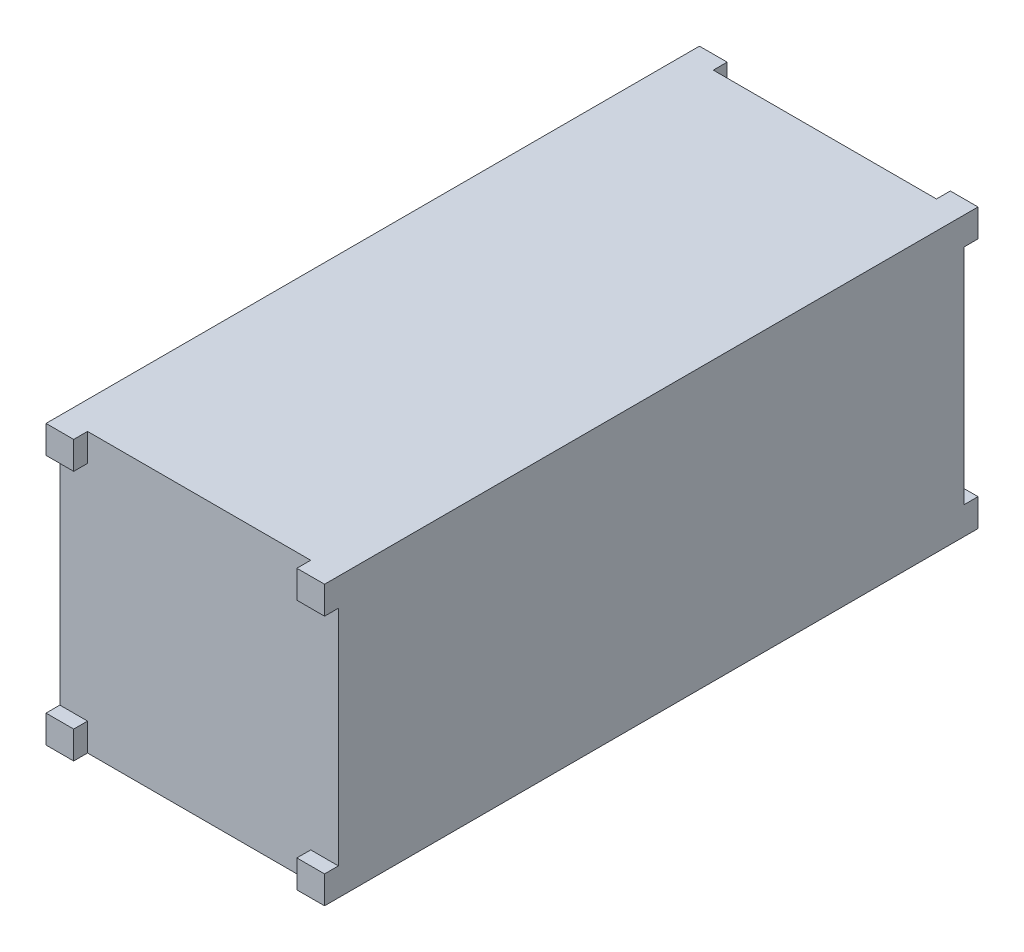
ISO-10303-21;
HEADER;
FILE_DESCRIPTION(('STEP AP214'),'2;1');
FILE_NAME('part.step','',(''),(''),'','','');
FILE_SCHEMA(('AUTOMOTIVE_DESIGN { 1 0 10303 214 1 1 1 1 }'));
ENDSEC;
DATA;
#1=APPLICATION_CONTEXT('core data for automotive mechanical design processes');
#2=APPLICATION_PROTOCOL_DEFINITION('international standard','automotive_design',2000,#1);
#3=PRODUCT_CONTEXT('',#1,'mechanical');
#4=PRODUCT('Part','Part','',(#3));
#5=PRODUCT_RELATED_PRODUCT_CATEGORY('part','',(#4));
#6=PRODUCT_DEFINITION_FORMATION('','',#4);
#7=PRODUCT_DEFINITION_CONTEXT('part definition',#1,'design');
#8=PRODUCT_DEFINITION('design','',#6,#7);
#9=PRODUCT_DEFINITION_SHAPE('','',#8);
#10=(LENGTH_UNIT() NAMED_UNIT(*) SI_UNIT(.MILLI.,.METRE.));
#11=(NAMED_UNIT(*) PLANE_ANGLE_UNIT() SI_UNIT($,.RADIAN.));
#12=(NAMED_UNIT(*) SI_UNIT($,.STERADIAN.) SOLID_ANGLE_UNIT());
#13=UNCERTAINTY_MEASURE_WITH_UNIT(LENGTH_MEASURE(1.E-05),#10,'distance_accuracy_value','');
#14=(GEOMETRIC_REPRESENTATION_CONTEXT(3) GLOBAL_UNCERTAINTY_ASSIGNED_CONTEXT((#13)) GLOBAL_UNIT_ASSIGNED_CONTEXT((#10,
#11,#12)) REPRESENTATION_CONTEXT('',''));
#15=CARTESIAN_POINT('',(0.,0.,0.));
#16=DIRECTION('',(0.,0.,1.));
#17=DIRECTION('',(1.,0.,0.));
#18=AXIS2_PLACEMENT_3D('',#15,#16,#17);
#19=CARTESIAN_POINT('',(0.,0.,-113.));
#20=DIRECTION('',(0.,0.,1.));
#21=DIRECTION('',(1.,0.,0.));
#22=AXIS2_PLACEMENT_3D('',#19,#20,#21);
#23=PLANE('',#22);
#24=DIRECTION('',(0.,1.,0.));
#25=VECTOR('',#24,1.);
#26=CARTESIAN_POINT('',(40.3,-50.3,-113.));
#27=LINE('',#26,#25);
#28=CARTESIAN_POINT('',(40.3,-50.3,-113.));
#29=VERTEX_POINT('',#28);
#30=CARTESIAN_POINT('',(40.3,-40.3,-113.));
#31=VERTEX_POINT('',#30);
#32=EDGE_CURVE('E240',#29,#31,#27,.T.);
#33=ORIENTED_EDGE('',*,*,#32,.F.);
#34=DIRECTION('',(1.,0.,0.));
#35=VECTOR('',#34,1.);
#36=CARTESIAN_POINT('',(50.3,-50.3,-113.));
#37=LINE('',#36,#35);
#38=CARTESIAN_POINT('',(-40.2999999999999,-50.3,-113.));
#39=VERTEX_POINT('',#38);
#40=EDGE_CURVE('E422',#39,#29,#37,.T.);
#41=ORIENTED_EDGE('',*,*,#40,.F.);
#42=DIRECTION('',(0.,-1.,0.));
#43=VECTOR('',#42,1.);
#44=CARTESIAN_POINT('',(-40.3,-50.3,-113.));
#45=LINE('',#44,#43);
#46=CARTESIAN_POINT('',(-40.3,-40.3000000000001,-113.));
#47=VERTEX_POINT('',#46);
#48=EDGE_CURVE('E256',#47,#39,#45,.T.);
#49=ORIENTED_EDGE('',*,*,#48,.F.);
#50=DIRECTION('',(1.,0.,0.));
#51=VECTOR('',#50,1.);
#52=CARTESIAN_POINT('',(-50.3,-40.3000000000001,-113.));
#53=LINE('',#52,#51);
#54=CARTESIAN_POINT('',(-50.3,-40.3000000000001,-113.));
#55=VERTEX_POINT('',#54);
#56=EDGE_CURVE('E251',#55,#47,#53,.T.);
#57=ORIENTED_EDGE('',*,*,#56,.F.);
#58=DIRECTION('',(0.,-1.,0.));
#59=VECTOR('',#58,1.);
#60=CARTESIAN_POINT('',(-50.3,-50.3,-113.));
#61=LINE('',#60,#59);
#62=CARTESIAN_POINT('',(-50.3,40.3000000000001,-113.));
#63=VERTEX_POINT('',#62);
#64=EDGE_CURVE('E409',#63,#55,#61,.T.);
#65=ORIENTED_EDGE('',*,*,#64,.F.);
#66=DIRECTION('',(-1.,0.,0.));
#67=VECTOR('',#66,1.);
#68=CARTESIAN_POINT('',(-50.3,40.3000000000001,-113.));
#69=LINE('',#68,#67);
#70=CARTESIAN_POINT('',(-40.3,40.3000000000001,-113.));
#71=VERTEX_POINT('',#70);
#72=EDGE_CURVE('E275',#71,#63,#69,.T.);
#73=ORIENTED_EDGE('',*,*,#72,.F.);
#74=DIRECTION('',(0.,-1.,0.));
#75=VECTOR('',#74,1.);
#76=CARTESIAN_POINT('',(-40.2999999999999,50.3000000000001,-113.));
#77=LINE('',#76,#75);
#78=CARTESIAN_POINT('',(-40.2999999999999,50.3000000000001,-113.));
#79=VERTEX_POINT('',#78);
#80=EDGE_CURVE('E270',#79,#71,#77,.T.);
#81=ORIENTED_EDGE('',*,*,#80,.F.);
#82=DIRECTION('',(-1.,0.,0.));
#83=VECTOR('',#82,1.);
#84=CARTESIAN_POINT('',(50.3,50.3,-113.));
#85=LINE('',#84,#83);
#86=CARTESIAN_POINT('',(40.3,50.3,-113.));
#87=VERTEX_POINT('',#86);
#88=EDGE_CURVE('E413',#87,#79,#85,.T.);
#89=ORIENTED_EDGE('',*,*,#88,.F.);
#90=DIRECTION('',(0.,1.,0.));
#91=VECTOR('',#90,1.);
#92=CARTESIAN_POINT('',(40.3,50.3,-113.));
#93=LINE('',#92,#91);
#94=CARTESIAN_POINT('',(40.3,40.3,-113.));
#95=VERTEX_POINT('',#94);
#96=EDGE_CURVE('E296',#95,#87,#93,.T.);
#97=ORIENTED_EDGE('',*,*,#96,.F.);
#98=DIRECTION('',(-1.,0.,0.));
#99=VECTOR('',#98,1.);
#100=CARTESIAN_POINT('',(50.3,40.3,-113.));
#101=LINE('',#100,#99);
#102=CARTESIAN_POINT('',(50.3,40.3,-113.));
#103=VERTEX_POINT('',#102);
#104=EDGE_CURVE('E291',#103,#95,#101,.T.);
#105=ORIENTED_EDGE('',*,*,#104,.F.);
#106=DIRECTION('',(0.,1.,0.));
#107=VECTOR('',#106,1.);
#108=CARTESIAN_POINT('',(50.3,-50.3,-113.));
#109=LINE('',#108,#107);
#110=CARTESIAN_POINT('',(50.3,-40.3,-113.));
#111=VERTEX_POINT('',#110);
#112=EDGE_CURVE('E424',#111,#103,#109,.T.);
#113=ORIENTED_EDGE('',*,*,#112,.F.);
#114=DIRECTION('',(1.,0.,0.));
#115=VECTOR('',#114,1.);
#116=CARTESIAN_POINT('',(50.3,-40.3,-113.));
#117=LINE('',#116,#115);
#118=EDGE_CURVE('E238',#31,#111,#117,.T.);
#119=ORIENTED_EDGE('',*,*,#118,.F.);
#120=EDGE_LOOP('',(#33,#41,#49,#57,#65,#73,#81,#89,#97,#105,#113,#119));
#121=FACE_BOUND('',#120,.T.);
#122=ADVANCED_FACE('F33',(#121),#23,.F.);
#123=CARTESIAN_POINT('',(0.,0.,113.));
#124=DIRECTION('',(0.,0.,1.));
#125=DIRECTION('',(1.,0.,0.));
#126=AXIS2_PLACEMENT_3D('',#123,#124,#125);
#127=PLANE('',#126);
#128=DIRECTION('',(-1.,0.,0.));
#129=VECTOR('',#128,1.);
#130=CARTESIAN_POINT('',(-50.3,-40.3,113.));
#131=LINE('',#130,#129);
#132=CARTESIAN_POINT('',(-40.3,-40.3,113.));
#133=VERTEX_POINT('',#132);
#134=CARTESIAN_POINT('',(-50.3,-40.3,113.));
#135=VERTEX_POINT('',#134);
#136=EDGE_CURVE('E321',#133,#135,#131,.T.);
#137=ORIENTED_EDGE('',*,*,#136,.F.);
#138=DIRECTION('',(0.,1.,0.));
#139=VECTOR('',#138,1.);
#140=CARTESIAN_POINT('',(-40.3,-50.3,113.));
#141=LINE('',#140,#139);
#142=CARTESIAN_POINT('',(-40.3,-50.3,113.));
#143=VERTEX_POINT('',#142);
#144=EDGE_CURVE('E316',#143,#133,#141,.T.);
#145=ORIENTED_EDGE('',*,*,#144,.F.);
#146=DIRECTION('',(1.,0.,0.));
#147=VECTOR('',#146,1.);
#148=CARTESIAN_POINT('',(50.3,-50.3,113.));
#149=LINE('',#148,#147);
#150=CARTESIAN_POINT('',(40.3,-50.3,113.));
#151=VERTEX_POINT('',#150);
#152=EDGE_CURVE('E412',#143,#151,#149,.T.);
#153=ORIENTED_EDGE('',*,*,#152,.T.);
#154=DIRECTION('',(0.,-1.,0.));
#155=VECTOR('',#154,1.);
#156=CARTESIAN_POINT('',(40.3,-50.3,113.));
#157=LINE('',#156,#155);
#158=CARTESIAN_POINT('',(40.3,-40.3,113.));
#159=VERTEX_POINT('',#158);
#160=EDGE_CURVE('E343',#159,#151,#157,.T.);
#161=ORIENTED_EDGE('',*,*,#160,.F.);
#162=DIRECTION('',(-1.,0.,0.));
#163=VECTOR('',#162,1.);
#164=CARTESIAN_POINT('',(50.3,-40.3,113.));
#165=LINE('',#164,#163);
#166=CARTESIAN_POINT('',(50.3,-40.3,113.));
#167=VERTEX_POINT('',#166);
#168=EDGE_CURVE('E340',#167,#159,#165,.T.);
#169=ORIENTED_EDGE('',*,*,#168,.F.);
#170=DIRECTION('',(0.,1.,0.));
#171=VECTOR('',#170,1.);
#172=CARTESIAN_POINT('',(50.3,-50.3,113.));
#173=LINE('',#172,#171);
#174=CARTESIAN_POINT('',(50.3,40.3,113.));
#175=VERTEX_POINT('',#174);
#176=EDGE_CURVE('E415',#167,#175,#173,.T.);
#177=ORIENTED_EDGE('',*,*,#176,.T.);
#178=DIRECTION('',(1.,0.,0.));
#179=VECTOR('',#178,1.);
#180=CARTESIAN_POINT('',(50.3,40.3,113.));
#181=LINE('',#180,#179);
#182=CARTESIAN_POINT('',(40.3,40.3,113.));
#183=VERTEX_POINT('',#182);
#184=EDGE_CURVE('E367',#183,#175,#181,.T.);
#185=ORIENTED_EDGE('',*,*,#184,.F.);
#186=DIRECTION('',(0.,-1.,0.));
#187=VECTOR('',#186,1.);
#188=CARTESIAN_POINT('',(40.3,50.3,113.));
#189=LINE('',#188,#187);
#190=CARTESIAN_POINT('',(40.3,50.3,113.));
#191=VERTEX_POINT('',#190);
#192=EDGE_CURVE('E362',#191,#183,#189,.T.);
#193=ORIENTED_EDGE('',*,*,#192,.F.);
#194=DIRECTION('',(-1.,0.,0.));
#195=VECTOR('',#194,1.);
#196=CARTESIAN_POINT('',(50.3,50.3,113.));
#197=LINE('',#196,#195);
#198=CARTESIAN_POINT('',(-40.2999999999999,50.3,113.));
#199=VERTEX_POINT('',#198);
#200=EDGE_CURVE('E417',#191,#199,#197,.T.);
#201=ORIENTED_EDGE('',*,*,#200,.T.);
#202=DIRECTION('',(0.,1.,0.));
#203=VECTOR('',#202,1.);
#204=CARTESIAN_POINT('',(-40.3,50.3,113.));
#205=LINE('',#204,#203);
#206=CARTESIAN_POINT('',(-40.3,40.3,113.));
#207=VERTEX_POINT('',#206);
#208=EDGE_CURVE('E389',#207,#199,#205,.T.);
#209=ORIENTED_EDGE('',*,*,#208,.F.);
#210=DIRECTION('',(1.,0.,0.));
#211=VECTOR('',#210,1.);
#212=CARTESIAN_POINT('',(-50.3,40.3,113.));
#213=LINE('',#212,#211);
#214=CARTESIAN_POINT('',(-50.3,40.3,113.));
#215=VERTEX_POINT('',#214);
#216=EDGE_CURVE('E384',#215,#207,#213,.T.);
#217=ORIENTED_EDGE('',*,*,#216,.F.);
#218=DIRECTION('',(0.,-1.,0.));
#219=VECTOR('',#218,1.);
#220=CARTESIAN_POINT('',(-50.3,-50.3,113.));
#221=LINE('',#220,#219);
#222=EDGE_CURVE('E410',#215,#135,#221,.T.);
#223=ORIENTED_EDGE('',*,*,#222,.T.);
#224=EDGE_LOOP('',(#137,#145,#153,#161,#169,#177,#185,#193,#201,#209,#217,#223));
#225=FACE_BOUND('',#224,.T.);
#226=ADVANCED_FACE('F484',(#225),#127,.T.);
#227=CARTESIAN_POINT('',(-50.3,-50.3,113.));
#228=DIRECTION('',(1.,0.,0.));
#229=DIRECTION('',(0.,0.,-1.));
#230=AXIS2_PLACEMENT_3D('',#227,#228,#229);
#231=PLANE('',#230);
#232=DIRECTION('',(0.,0.,-1.));
#233=VECTOR('',#232,1.);
#234=CARTESIAN_POINT('',(-50.3,50.3,113.));
#235=LINE('',#234,#233);
#236=CARTESIAN_POINT('',(-50.3,50.3,118.));
#237=VERTEX_POINT('',#236);
#238=CARTESIAN_POINT('',(-50.2999999999999,50.3000000000001,-118.));
#239=VERTEX_POINT('',#238);
#240=EDGE_CURVE('E419',#237,#239,#235,.T.);
#241=ORIENTED_EDGE('',*,*,#240,.T.);
#242=DIRECTION('',(0.,1.,0.));
#243=VECTOR('',#242,1.);
#244=CARTESIAN_POINT('',(-50.2999999999999,50.3000000000001,-118.));
#245=LINE('',#244,#243);
#246=CARTESIAN_POINT('',(-50.3,40.3000000000001,-118.));
#247=VERTEX_POINT('',#246);
#248=EDGE_CURVE('E271',#247,#239,#245,.T.);
#249=ORIENTED_EDGE('',*,*,#248,.F.);
#250=DIRECTION('',(0.,0.,1.));
#251=VECTOR('',#250,1.);
#252=CARTESIAN_POINT('',(-50.3,40.3000000000001,-118.));
#253=LINE('',#252,#251);
#254=EDGE_CURVE('E281',#247,#63,#253,.T.);
#255=ORIENTED_EDGE('',*,*,#254,.T.);
#256=ORIENTED_EDGE('',*,*,#64,.T.);
#257=DIRECTION('',(0.,0.,1.));
#258=VECTOR('',#257,1.);
#259=CARTESIAN_POINT('',(-50.3,-40.3000000000001,-118.));
#260=LINE('',#259,#258);
#261=CARTESIAN_POINT('',(-50.3,-40.3000000000001,-118.));
#262=VERTEX_POINT('',#261);
#263=EDGE_CURVE('E268',#262,#55,#260,.T.);
#264=ORIENTED_EDGE('',*,*,#263,.F.);
#265=DIRECTION('',(0.,1.,0.));
#266=VECTOR('',#265,1.);
#267=CARTESIAN_POINT('',(-50.3,-50.3000000000001,-118.));
#268=LINE('',#267,#266);
#269=CARTESIAN_POINT('',(-50.3,-50.3000000000001,-118.));
#270=VERTEX_POINT('',#269);
#271=EDGE_CURVE('E255',#270,#262,#268,.T.);
#272=ORIENTED_EDGE('',*,*,#271,.F.);
#273=DIRECTION('',(0.,0.,-1.));
#274=VECTOR('',#273,1.);
#275=CARTESIAN_POINT('',(-50.3,-50.3,113.));
#276=LINE('',#275,#274);
#277=CARTESIAN_POINT('',(-50.3,-50.3,118.));
#278=VERTEX_POINT('',#277);
#279=EDGE_CURVE('E11',#278,#270,#276,.T.);
#280=ORIENTED_EDGE('',*,*,#279,.F.);
#281=DIRECTION('',(0.,-1.,0.));
#282=VECTOR('',#281,1.);
#283=CARTESIAN_POINT('',(-50.3,-50.3,118.));
#284=LINE('',#283,#282);
#285=CARTESIAN_POINT('',(-50.3,-40.3,118.));
#286=VERTEX_POINT('',#285);
#287=EDGE_CURVE('E317',#286,#278,#284,.T.);
#288=ORIENTED_EDGE('',*,*,#287,.F.);
#289=DIRECTION('',(0.,0.,-1.));
#290=VECTOR('',#289,1.);
#291=CARTESIAN_POINT('',(-50.3,-40.3,118.));
#292=LINE('',#291,#290);
#293=EDGE_CURVE('E327',#286,#135,#292,.T.);
#294=ORIENTED_EDGE('',*,*,#293,.T.);
#295=ORIENTED_EDGE('',*,*,#222,.F.);
#296=DIRECTION('',(0.,0.,-1.));
#297=VECTOR('',#296,1.);
#298=CARTESIAN_POINT('',(-50.3,40.3,118.));
#299=LINE('',#298,#297);
#300=CARTESIAN_POINT('',(-50.3,40.3,118.));
#301=VERTEX_POINT('',#300);
#302=EDGE_CURVE('E406',#301,#215,#299,.T.);
#303=ORIENTED_EDGE('',*,*,#302,.F.);
#304=DIRECTION('',(0.,-1.,0.));
#305=VECTOR('',#304,1.);
#306=CARTESIAN_POINT('',(-50.3,50.3,118.));
#307=LINE('',#306,#305);
#308=EDGE_CURVE('E385',#237,#301,#307,.T.);
#309=ORIENTED_EDGE('',*,*,#308,.F.);
#310=EDGE_LOOP('',(#241,#249,#255,#256,#264,#272,#280,#288,#294,#295,#303,#309));
#311=FACE_BOUND('',#310,.T.);
#312=ADVANCED_FACE('F35',(#311),#231,.F.);
#313=CARTESIAN_POINT('',(50.3,-50.3,113.));
#314=DIRECTION('',(0.,1.,0.));
#315=DIRECTION('',(0.,0.,1.));
#316=AXIS2_PLACEMENT_3D('',#313,#314,#315);
#317=PLANE('',#316);
#318=ORIENTED_EDGE('',*,*,#279,.T.);
#319=DIRECTION('',(-1.,0.,0.));
#320=VECTOR('',#319,1.);
#321=CARTESIAN_POINT('',(-50.3,-50.3000000000001,-118.));
#322=LINE('',#321,#320);
#323=CARTESIAN_POINT('',(-40.3,-50.3,-118.));
#324=VERTEX_POINT('',#323);
#325=EDGE_CURVE('E252',#324,#270,#322,.T.);
#326=ORIENTED_EDGE('',*,*,#325,.F.);
#327=DIRECTION('',(0.,0.,1.));
#328=VECTOR('',#327,1.);
#329=CARTESIAN_POINT('',(-40.3,-50.3,-118.));
#330=LINE('',#329,#328);
#331=EDGE_CURVE('E56',#324,#39,#330,.T.);
#332=ORIENTED_EDGE('',*,*,#331,.T.);
#333=ORIENTED_EDGE('',*,*,#40,.T.);
#334=DIRECTION('',(0.,0.,1.));
#335=VECTOR('',#334,1.);
#336=CARTESIAN_POINT('',(40.3,-50.3,-118.));
#337=LINE('',#336,#335);
#338=CARTESIAN_POINT('',(40.3,-50.3,-118.));
#339=VERTEX_POINT('',#338);
#340=EDGE_CURVE('E230',#339,#29,#337,.T.);
#341=ORIENTED_EDGE('',*,*,#340,.F.);
#342=DIRECTION('',(-1.,0.,0.));
#343=VECTOR('',#342,1.);
#344=CARTESIAN_POINT('',(50.3,-50.3,-118.));
#345=LINE('',#344,#343);
#346=CARTESIAN_POINT('',(50.3,-50.3,-118.));
#347=VERTEX_POINT('',#346);
#348=EDGE_CURVE('E228',#347,#339,#345,.T.);
#349=ORIENTED_EDGE('',*,*,#348,.F.);
#350=DIRECTION('',(0.,0.,-1.));
#351=VECTOR('',#350,1.);
#352=CARTESIAN_POINT('',(50.3,-50.3,113.));
#353=LINE('',#352,#351);
#354=CARTESIAN_POINT('',(50.3,-50.3,118.));
#355=VERTEX_POINT('',#354);
#356=EDGE_CURVE('E41',#355,#347,#353,.T.);
#357=ORIENTED_EDGE('',*,*,#356,.F.);
#358=DIRECTION('',(1.,0.,0.));
#359=VECTOR('',#358,1.);
#360=CARTESIAN_POINT('',(50.3,-50.3,118.));
#361=LINE('',#360,#359);
#362=CARTESIAN_POINT('',(40.3,-50.3,118.));
#363=VERTEX_POINT('',#362);
#364=EDGE_CURVE('E341',#363,#355,#361,.T.);
#365=ORIENTED_EDGE('',*,*,#364,.F.);
#366=DIRECTION('',(0.,0.,-1.));
#367=VECTOR('',#366,1.);
#368=CARTESIAN_POINT('',(40.3,-50.3,118.));
#369=LINE('',#368,#367);
#370=EDGE_CURVE('E349',#363,#151,#369,.T.);
#371=ORIENTED_EDGE('',*,*,#370,.T.);
#372=ORIENTED_EDGE('',*,*,#152,.F.);
#373=DIRECTION('',(0.,0.,-1.));
#374=VECTOR('',#373,1.);
#375=CARTESIAN_POINT('',(-40.3,-50.3,118.));
#376=LINE('',#375,#374);
#377=CARTESIAN_POINT('',(-40.3,-50.3,118.));
#378=VERTEX_POINT('',#377);
#379=EDGE_CURVE('E337',#378,#143,#376,.T.);
#380=ORIENTED_EDGE('',*,*,#379,.F.);
#381=DIRECTION('',(1.,0.,0.));
#382=VECTOR('',#381,1.);
#383=CARTESIAN_POINT('',(-50.3,-50.3,118.));
#384=LINE('',#383,#382);
#385=EDGE_CURVE('E320',#278,#378,#384,.T.);
#386=ORIENTED_EDGE('',*,*,#385,.F.);
#387=EDGE_LOOP('',(#318,#326,#332,#333,#341,#349,#357,#365,#371,#372,#380,#386));
#388=FACE_BOUND('',#387,.T.);
#389=ADVANCED_FACE('F229',(#388),#317,.F.);
#390=CARTESIAN_POINT('',(50.3,-50.3,113.));
#391=DIRECTION('',(-1.,0.,0.));
#392=DIRECTION('',(0.,0.,1.));
#393=AXIS2_PLACEMENT_3D('',#390,#391,#392);
#394=PLANE('',#393);
#395=ORIENTED_EDGE('',*,*,#356,.T.);
#396=DIRECTION('',(0.,-1.,0.));
#397=VECTOR('',#396,1.);
#398=CARTESIAN_POINT('',(50.3,-50.3,-118.));
#399=LINE('',#398,#397);
#400=CARTESIAN_POINT('',(50.3,-40.3,-118.));
#401=VERTEX_POINT('',#400);
#402=EDGE_CURVE('E221',#401,#347,#399,.T.);
#403=ORIENTED_EDGE('',*,*,#402,.F.);
#404=DIRECTION('',(0.,0.,1.));
#405=VECTOR('',#404,1.);
#406=CARTESIAN_POINT('',(50.3,-40.3,-118.));
#407=LINE('',#406,#405);
#408=EDGE_CURVE('E48',#401,#111,#407,.T.);
#409=ORIENTED_EDGE('',*,*,#408,.T.);
#410=ORIENTED_EDGE('',*,*,#112,.T.);
#411=DIRECTION('',(0.,0.,1.));
#412=VECTOR('',#411,1.);
#413=CARTESIAN_POINT('',(50.3,40.3,-118.));
#414=LINE('',#413,#412);
#415=CARTESIAN_POINT('',(50.3,40.3,-118.));
#416=VERTEX_POINT('',#415);
#417=EDGE_CURVE('E313',#416,#103,#414,.T.);
#418=ORIENTED_EDGE('',*,*,#417,.F.);
#419=DIRECTION('',(0.,-1.,0.));
#420=VECTOR('',#419,1.);
#421=CARTESIAN_POINT('',(50.3,50.3,-118.));
#422=LINE('',#421,#420);
#423=CARTESIAN_POINT('',(50.3,50.3,-118.));
#424=VERTEX_POINT('',#423);
#425=EDGE_CURVE('E292',#424,#416,#422,.T.);
#426=ORIENTED_EDGE('',*,*,#425,.F.);
#427=DIRECTION('',(0.,0.,-1.));
#428=VECTOR('',#427,1.);
#429=CARTESIAN_POINT('',(50.3,50.3,113.));
#430=LINE('',#429,#428);
#431=CARTESIAN_POINT('',(50.3,50.3,118.));
#432=VERTEX_POINT('',#431);
#433=EDGE_CURVE('E226',#432,#424,#430,.T.);
#434=ORIENTED_EDGE('',*,*,#433,.F.);
#435=DIRECTION('',(0.,1.,0.));
#436=VECTOR('',#435,1.);
#437=CARTESIAN_POINT('',(50.3,50.3,118.));
#438=LINE('',#437,#436);
#439=CARTESIAN_POINT('',(50.3,40.3,118.));
#440=VERTEX_POINT('',#439);
#441=EDGE_CURVE('E363',#440,#432,#438,.T.);
#442=ORIENTED_EDGE('',*,*,#441,.F.);
#443=DIRECTION('',(0.,0.,-1.));
#444=VECTOR('',#443,1.);
#445=CARTESIAN_POINT('',(50.3,40.3,118.));
#446=LINE('',#445,#444);
#447=EDGE_CURVE('E373',#440,#175,#446,.T.);
#448=ORIENTED_EDGE('',*,*,#447,.T.);
#449=ORIENTED_EDGE('',*,*,#176,.F.);
#450=DIRECTION('',(0.,0.,-1.));
#451=VECTOR('',#450,1.);
#452=CARTESIAN_POINT('',(50.3,-40.3,118.));
#453=LINE('',#452,#451);
#454=CARTESIAN_POINT('',(50.3,-40.3,118.));
#455=VERTEX_POINT('',#454);
#456=EDGE_CURVE('E359',#455,#167,#453,.T.);
#457=ORIENTED_EDGE('',*,*,#456,.F.);
#458=DIRECTION('',(0.,1.,0.));
#459=VECTOR('',#458,1.);
#460=CARTESIAN_POINT('',(50.3,-50.3,118.));
#461=LINE('',#460,#459);
#462=EDGE_CURVE('E223',#355,#455,#461,.T.);
#463=ORIENTED_EDGE('',*,*,#462,.F.);
#464=EDGE_LOOP('',(#395,#403,#409,#410,#418,#426,#434,#442,#448,#449,#457,#463));
#465=FACE_BOUND('',#464,.T.);
#466=ADVANCED_FACE('F219',(#465),#394,.F.);
#467=CARTESIAN_POINT('',(50.3,50.3,113.));
#468=DIRECTION('',(0.,-1.,0.));
#469=DIRECTION('',(1.,0.,0.));
#470=AXIS2_PLACEMENT_3D('',#467,#468,#469);
#471=PLANE('',#470);
#472=ORIENTED_EDGE('',*,*,#433,.T.);
#473=DIRECTION('',(1.,0.,0.));
#474=VECTOR('',#473,1.);
#475=CARTESIAN_POINT('',(50.3,50.3,-118.));
#476=LINE('',#475,#474);
#477=CARTESIAN_POINT('',(40.3,50.3,-118.));
#478=VERTEX_POINT('',#477);
#479=EDGE_CURVE('E300',#478,#424,#476,.T.);
#480=ORIENTED_EDGE('',*,*,#479,.F.);
#481=DIRECTION('',(0.,0.,1.));
#482=VECTOR('',#481,1.);
#483=CARTESIAN_POINT('',(40.3,50.3,-118.));
#484=LINE('',#483,#482);
#485=EDGE_CURVE('E303',#478,#87,#484,.T.);
#486=ORIENTED_EDGE('',*,*,#485,.T.);
#487=ORIENTED_EDGE('',*,*,#88,.T.);
#488=DIRECTION('',(0.,0.,1.));
#489=VECTOR('',#488,1.);
#490=CARTESIAN_POINT('',(-40.2999999999999,50.3000000000001,-118.));
#491=LINE('',#490,#489);
#492=CARTESIAN_POINT('',(-40.2999999999999,50.3000000000001,-118.));
#493=VERTEX_POINT('',#492);
#494=EDGE_CURVE('E289',#493,#79,#491,.T.);
#495=ORIENTED_EDGE('',*,*,#494,.F.);
#496=DIRECTION('',(1.,0.,0.));
#497=VECTOR('',#496,1.);
#498=CARTESIAN_POINT('',(-50.2999999999999,50.3000000000001,-118.));
#499=LINE('',#498,#497);
#500=EDGE_CURVE('E274',#239,#493,#499,.T.);
#501=ORIENTED_EDGE('',*,*,#500,.F.);
#502=ORIENTED_EDGE('',*,*,#240,.F.);
#503=DIRECTION('',(-1.,0.,0.));
#504=VECTOR('',#503,1.);
#505=CARTESIAN_POINT('',(-50.3,50.3,118.));
#506=LINE('',#505,#504);
#507=CARTESIAN_POINT('',(-40.3,50.3,118.));
#508=VERTEX_POINT('',#507);
#509=EDGE_CURVE('E393',#508,#237,#506,.T.);
#510=ORIENTED_EDGE('',*,*,#509,.F.);
#511=DIRECTION('',(0.,0.,-1.));
#512=VECTOR('',#511,1.);
#513=CARTESIAN_POINT('',(-40.3,50.3,118.));
#514=LINE('',#513,#512);
#515=EDGE_CURVE('E396',#508,#199,#514,.T.);
#516=ORIENTED_EDGE('',*,*,#515,.T.);
#517=ORIENTED_EDGE('',*,*,#200,.F.);
#518=DIRECTION('',(0.,0.,-1.));
#519=VECTOR('',#518,1.);
#520=CARTESIAN_POINT('',(40.3,50.3,118.));
#521=LINE('',#520,#519);
#522=CARTESIAN_POINT('',(40.3,50.3,118.));
#523=VERTEX_POINT('',#522);
#524=EDGE_CURVE('E382',#523,#191,#521,.T.);
#525=ORIENTED_EDGE('',*,*,#524,.F.);
#526=DIRECTION('',(-1.,0.,0.));
#527=VECTOR('',#526,1.);
#528=CARTESIAN_POINT('',(50.3,50.3,118.));
#529=LINE('',#528,#527);
#530=EDGE_CURVE('E366',#432,#523,#529,.T.);
#531=ORIENTED_EDGE('',*,*,#530,.F.);
#532=EDGE_LOOP('',(#472,#480,#486,#487,#495,#501,#502,#510,#516,#517,#525,#531));
#533=FACE_BOUND('',#532,.T.);
#534=ADVANCED_FACE('F432',(#533),#471,.F.);
#535=CARTESIAN_POINT('',(-50.3,40.3,118.));
#536=DIRECTION('',(0.,1.,0.));
#537=DIRECTION('',(0.,0.,1.));
#538=AXIS2_PLACEMENT_3D('',#535,#536,#537);
#539=PLANE('',#538);
#540=ORIENTED_EDGE('',*,*,#216,.T.);
#541=DIRECTION('',(0.,0.,-1.));
#542=VECTOR('',#541,1.);
#543=CARTESIAN_POINT('',(-40.3,40.3,118.));
#544=LINE('',#543,#542);
#545=CARTESIAN_POINT('',(-40.3,40.3,118.));
#546=VERTEX_POINT('',#545);
#547=EDGE_CURVE('E403',#546,#207,#544,.T.);
#548=ORIENTED_EDGE('',*,*,#547,.F.);
#549=DIRECTION('',(1.,0.,0.));
#550=VECTOR('',#549,1.);
#551=CARTESIAN_POINT('',(-50.3,40.3,118.));
#552=LINE('',#551,#550);
#553=EDGE_CURVE('E388',#301,#546,#552,.T.);
#554=ORIENTED_EDGE('',*,*,#553,.F.);
#555=ORIENTED_EDGE('',*,*,#302,.T.);
#556=EDGE_LOOP('',(#540,#548,#554,#555));
#557=FACE_BOUND('',#556,.T.);
#558=ADVANCED_FACE('F476',(#557),#539,.F.);
#559=CARTESIAN_POINT('',(-40.3,50.3,118.));
#560=DIRECTION('',(-1.,0.,0.));
#561=DIRECTION('',(0.,0.,1.));
#562=AXIS2_PLACEMENT_3D('',#559,#560,#561);
#563=PLANE('',#562);
#564=ORIENTED_EDGE('',*,*,#208,.T.);
#565=ORIENTED_EDGE('',*,*,#515,.F.);
#566=DIRECTION('',(0.,1.,0.));
#567=VECTOR('',#566,1.);
#568=CARTESIAN_POINT('',(-40.3,50.3,118.));
#569=LINE('',#568,#567);
#570=EDGE_CURVE('E391',#546,#508,#569,.T.);
#571=ORIENTED_EDGE('',*,*,#570,.F.);
#572=ORIENTED_EDGE('',*,*,#547,.T.);
#573=EDGE_LOOP('',(#564,#565,#571,#572));
#574=FACE_BOUND('',#573,.T.);
#575=ADVANCED_FACE('F479',(#574),#563,.F.);
#576=CARTESIAN_POINT('',(0.,0.,118.));
#577=DIRECTION('',(0.,0.,1.));
#578=DIRECTION('',(1.,0.,0.));
#579=AXIS2_PLACEMENT_3D('',#576,#577,#578);
#580=PLANE('',#579);
#581=ORIENTED_EDGE('',*,*,#308,.T.);
#582=ORIENTED_EDGE('',*,*,#553,.T.);
#583=ORIENTED_EDGE('',*,*,#570,.T.);
#584=ORIENTED_EDGE('',*,*,#509,.T.);
#585=EDGE_LOOP('',(#581,#582,#583,#584));
#586=FACE_BOUND('',#585,.T.);
#587=ADVANCED_FACE('F470',(#586),#580,.T.);
#588=CARTESIAN_POINT('',(40.3,50.3,118.));
#589=DIRECTION('',(1.,0.,0.));
#590=DIRECTION('',(0.,0.,-1.));
#591=AXIS2_PLACEMENT_3D('',#588,#589,#590);
#592=PLANE('',#591);
#593=ORIENTED_EDGE('',*,*,#192,.T.);
#594=DIRECTION('',(0.,0.,-1.));
#595=VECTOR('',#594,1.);
#596=CARTESIAN_POINT('',(40.3,40.3,118.));
#597=LINE('',#596,#595);
#598=CARTESIAN_POINT('',(40.3,40.3,118.));
#599=VERTEX_POINT('',#598);
#600=EDGE_CURVE('E380',#599,#183,#597,.T.);
#601=ORIENTED_EDGE('',*,*,#600,.F.);
#602=DIRECTION('',(0.,-1.,0.));
#603=VECTOR('',#602,1.);
#604=CARTESIAN_POINT('',(40.3,50.3,118.));
#605=LINE('',#604,#603);
#606=EDGE_CURVE('E369',#523,#599,#605,.T.);
#607=ORIENTED_EDGE('',*,*,#606,.F.);
#608=ORIENTED_EDGE('',*,*,#524,.T.);
#609=EDGE_LOOP('',(#593,#601,#607,#608));
#610=FACE_BOUND('',#609,.T.);
#611=ADVANCED_FACE('F488',(#610),#592,.F.);
#612=CARTESIAN_POINT('',(50.3,40.3,118.));
#613=DIRECTION('',(0.,1.,0.));
#614=DIRECTION('',(-1.,0.,0.));
#615=AXIS2_PLACEMENT_3D('',#612,#613,#614);
#616=PLANE('',#615);
#617=ORIENTED_EDGE('',*,*,#184,.T.);
#618=ORIENTED_EDGE('',*,*,#447,.F.);
#619=DIRECTION('',(1.,0.,0.));
#620=VECTOR('',#619,1.);
#621=CARTESIAN_POINT('',(50.3,40.3,118.));
#622=LINE('',#621,#620);
#623=EDGE_CURVE('E371',#599,#440,#622,.T.);
#624=ORIENTED_EDGE('',*,*,#623,.F.);
#625=ORIENTED_EDGE('',*,*,#600,.T.);
#626=EDGE_LOOP('',(#617,#618,#624,#625));
#627=FACE_BOUND('',#626,.T.);
#628=ADVANCED_FACE('F495',(#627),#616,.F.);
#629=CARTESIAN_POINT('',(0.,0.,118.));
#630=DIRECTION('',(0.,0.,-1.));
#631=DIRECTION('',(-1.,0.,0.));
#632=AXIS2_PLACEMENT_3D('',#629,#630,#631);
#633=PLANE('',#632);
#634=ORIENTED_EDGE('',*,*,#441,.T.);
#635=ORIENTED_EDGE('',*,*,#530,.T.);
#636=ORIENTED_EDGE('',*,*,#606,.T.);
#637=ORIENTED_EDGE('',*,*,#623,.T.);
#638=EDGE_LOOP('',(#634,#635,#636,#637));
#639=FACE_BOUND('',#638,.T.);
#640=ADVANCED_FACE('F491',(#639),#633,.F.);
#641=CARTESIAN_POINT('',(50.3,-40.3,118.));
#642=DIRECTION('',(0.,-1.,0.));
#643=DIRECTION('',(1.,0.,0.));
#644=AXIS2_PLACEMENT_3D('',#641,#642,#643);
#645=PLANE('',#644);
#646=ORIENTED_EDGE('',*,*,#168,.T.);
#647=DIRECTION('',(0.,0.,-1.));
#648=VECTOR('',#647,1.);
#649=CARTESIAN_POINT('',(40.3,-40.3,118.));
#650=LINE('',#649,#648);
#651=CARTESIAN_POINT('',(40.3,-40.3,118.));
#652=VERTEX_POINT('',#651);
#653=EDGE_CURVE('E356',#652,#159,#650,.T.);
#654=ORIENTED_EDGE('',*,*,#653,.F.);
#655=DIRECTION('',(-1.,0.,0.));
#656=VECTOR('',#655,1.);
#657=CARTESIAN_POINT('',(50.3,-40.3,118.));
#658=LINE('',#657,#656);
#659=EDGE_CURVE('E345',#455,#652,#658,.T.);
#660=ORIENTED_EDGE('',*,*,#659,.F.);
#661=ORIENTED_EDGE('',*,*,#456,.T.);
#662=EDGE_LOOP('',(#646,#654,#660,#661));
#663=FACE_BOUND('',#662,.T.);
#664=ADVANCED_FACE('F502',(#663),#645,.F.);
#665=CARTESIAN_POINT('',(40.3,-50.3,118.));
#666=DIRECTION('',(1.,0.,0.));
#667=DIRECTION('',(0.,0.,-1.));
#668=AXIS2_PLACEMENT_3D('',#665,#666,#667);
#669=PLANE('',#668);
#670=ORIENTED_EDGE('',*,*,#160,.T.);
#671=ORIENTED_EDGE('',*,*,#370,.F.);
#672=DIRECTION('',(0.,-1.,0.));
#673=VECTOR('',#672,1.);
#674=CARTESIAN_POINT('',(40.3,-50.3,118.));
#675=LINE('',#674,#673);
#676=EDGE_CURVE('E347',#652,#363,#675,.T.);
#677=ORIENTED_EDGE('',*,*,#676,.F.);
#678=ORIENTED_EDGE('',*,*,#653,.T.);
#679=EDGE_LOOP('',(#670,#671,#677,#678));
#680=FACE_BOUND('',#679,.T.);
#681=ADVANCED_FACE('F577',(#680),#669,.F.);
#682=CARTESIAN_POINT('',(0.,0.,118.));
#683=DIRECTION('',(0.,0.,-1.));
#684=DIRECTION('',(-1.,0.,0.));
#685=AXIS2_PLACEMENT_3D('',#682,#683,#684);
#686=PLANE('',#685);
#687=ORIENTED_EDGE('',*,*,#364,.T.);
#688=ORIENTED_EDGE('',*,*,#462,.T.);
#689=ORIENTED_EDGE('',*,*,#659,.T.);
#690=ORIENTED_EDGE('',*,*,#676,.T.);
#691=EDGE_LOOP('',(#687,#688,#689,#690));
#692=FACE_BOUND('',#691,.T.);
#693=ADVANCED_FACE('F587',(#692),#686,.F.);
#694=CARTESIAN_POINT('',(-40.3,-50.3,118.));
#695=DIRECTION('',(-1.,0.,0.));
#696=DIRECTION('',(0.,0.,1.));
#697=AXIS2_PLACEMENT_3D('',#694,#695,#696);
#698=PLANE('',#697);
#699=ORIENTED_EDGE('',*,*,#144,.T.);
#700=DIRECTION('',(0.,0.,-1.));
#701=VECTOR('',#700,1.);
#702=CARTESIAN_POINT('',(-40.3,-40.3,118.));
#703=LINE('',#702,#701);
#704=CARTESIAN_POINT('',(-40.3,-40.3,118.));
#705=VERTEX_POINT('',#704);
#706=EDGE_CURVE('E334',#705,#133,#703,.T.);
#707=ORIENTED_EDGE('',*,*,#706,.F.);
#708=DIRECTION('',(0.,1.,0.));
#709=VECTOR('',#708,1.);
#710=CARTESIAN_POINT('',(-40.3,-50.3,118.));
#711=LINE('',#710,#709);
#712=EDGE_CURVE('E323',#378,#705,#711,.T.);
#713=ORIENTED_EDGE('',*,*,#712,.F.);
#714=ORIENTED_EDGE('',*,*,#379,.T.);
#715=EDGE_LOOP('',(#699,#707,#713,#714));
#716=FACE_BOUND('',#715,.T.);
#717=ADVANCED_FACE('F597',(#716),#698,.F.);
#718=CARTESIAN_POINT('',(-50.3,-40.3,118.));
#719=DIRECTION('',(0.,-1.,0.));
#720=DIRECTION('',(0.,0.,-1.));
#721=AXIS2_PLACEMENT_3D('',#718,#719,#720);
#722=PLANE('',#721);
#723=ORIENTED_EDGE('',*,*,#136,.T.);
#724=ORIENTED_EDGE('',*,*,#293,.F.);
#725=DIRECTION('',(-1.,0.,0.));
#726=VECTOR('',#725,1.);
#727=CARTESIAN_POINT('',(-50.3,-40.3,118.));
#728=LINE('',#727,#726);
#729=EDGE_CURVE('E325',#705,#286,#728,.T.);
#730=ORIENTED_EDGE('',*,*,#729,.F.);
#731=ORIENTED_EDGE('',*,*,#706,.T.);
#732=EDGE_LOOP('',(#723,#724,#730,#731));
#733=FACE_BOUND('',#732,.T.);
#734=ADVANCED_FACE('F607',(#733),#722,.F.);
#735=CARTESIAN_POINT('',(0.,0.,118.));
#736=DIRECTION('',(0.,0.,-1.));
#737=DIRECTION('',(-1.,0.,0.));
#738=AXIS2_PLACEMENT_3D('',#735,#736,#737);
#739=PLANE('',#738);
#740=ORIENTED_EDGE('',*,*,#287,.T.);
#741=ORIENTED_EDGE('',*,*,#385,.T.);
#742=ORIENTED_EDGE('',*,*,#712,.T.);
#743=ORIENTED_EDGE('',*,*,#729,.T.);
#744=EDGE_LOOP('',(#740,#741,#742,#743));
#745=FACE_BOUND('',#744,.T.);
#746=ADVANCED_FACE('F617',(#745),#739,.F.);
#747=CARTESIAN_POINT('',(50.3,40.3,-118.));
#748=DIRECTION('',(0.,1.,0.));
#749=DIRECTION('',(0.,0.,1.));
#750=AXIS2_PLACEMENT_3D('',#747,#748,#749);
#751=PLANE('',#750);
#752=ORIENTED_EDGE('',*,*,#104,.T.);
#753=DIRECTION('',(0.,0.,1.));
#754=VECTOR('',#753,1.);
#755=CARTESIAN_POINT('',(40.3,40.3,-118.));
#756=LINE('',#755,#754);
#757=CARTESIAN_POINT('',(40.3,40.3,-118.));
#758=VERTEX_POINT('',#757);
#759=EDGE_CURVE('E310',#758,#95,#756,.T.);
#760=ORIENTED_EDGE('',*,*,#759,.F.);
#761=DIRECTION('',(-1.,0.,0.));
#762=VECTOR('',#761,1.);
#763=CARTESIAN_POINT('',(50.3,40.3,-118.));
#764=LINE('',#763,#762);
#765=EDGE_CURVE('E295',#416,#758,#764,.T.);
#766=ORIENTED_EDGE('',*,*,#765,.F.);
#767=ORIENTED_EDGE('',*,*,#417,.T.);
#768=EDGE_LOOP('',(#752,#760,#766,#767));
#769=FACE_BOUND('',#768,.T.);
#770=ADVANCED_FACE('F444',(#769),#751,.F.);
#771=CARTESIAN_POINT('',(40.3,50.3,-118.));
#772=DIRECTION('',(1.,0.,0.));
#773=DIRECTION('',(0.,0.,-1.));
#774=AXIS2_PLACEMENT_3D('',#771,#772,#773);
#775=PLANE('',#774);
#776=ORIENTED_EDGE('',*,*,#96,.T.);
#777=ORIENTED_EDGE('',*,*,#485,.F.);
#778=DIRECTION('',(0.,1.,0.));
#779=VECTOR('',#778,1.);
#780=CARTESIAN_POINT('',(40.3,50.3,-118.));
#781=LINE('',#780,#779);
#782=EDGE_CURVE('E298',#758,#478,#781,.T.);
#783=ORIENTED_EDGE('',*,*,#782,.F.);
#784=ORIENTED_EDGE('',*,*,#759,.T.);
#785=EDGE_LOOP('',(#776,#777,#783,#784));
#786=FACE_BOUND('',#785,.T.);
#787=ADVANCED_FACE('F447',(#786),#775,.F.);
#788=CARTESIAN_POINT('',(0.,0.,-118.));
#789=DIRECTION('',(0.,0.,-1.));
#790=DIRECTION('',(-1.,0.,0.));
#791=AXIS2_PLACEMENT_3D('',#788,#789,#790);
#792=PLANE('',#791);
#793=ORIENTED_EDGE('',*,*,#425,.T.);
#794=ORIENTED_EDGE('',*,*,#765,.T.);
#795=ORIENTED_EDGE('',*,*,#782,.T.);
#796=ORIENTED_EDGE('',*,*,#479,.T.);
#797=EDGE_LOOP('',(#793,#794,#795,#796));
#798=FACE_BOUND('',#797,.T.);
#799=ADVANCED_FACE('F437',(#798),#792,.T.);
#800=CARTESIAN_POINT('',(-40.2999999999999,50.3000000000001,-118.));
#801=DIRECTION('',(-1.,0.,0.));
#802=DIRECTION('',(0.,-1.,0.));
#803=AXIS2_PLACEMENT_3D('',#800,#801,#802);
#804=PLANE('',#803);
#805=ORIENTED_EDGE('',*,*,#80,.T.);
#806=DIRECTION('',(0.,0.,1.));
#807=VECTOR('',#806,1.);
#808=CARTESIAN_POINT('',(-40.3,40.3000000000001,-118.));
#809=LINE('',#808,#807);
#810=CARTESIAN_POINT('',(-40.3,40.3000000000001,-118.));
#811=VERTEX_POINT('',#810);
#812=EDGE_CURVE('E286',#811,#71,#809,.T.);
#813=ORIENTED_EDGE('',*,*,#812,.F.);
#814=DIRECTION('',(0.,-1.,0.));
#815=VECTOR('',#814,1.);
#816=CARTESIAN_POINT('',(-40.2999999999999,50.3000000000001,-118.));
#817=LINE('',#816,#815);
#818=EDGE_CURVE('E277',#493,#811,#817,.T.);
#819=ORIENTED_EDGE('',*,*,#818,.F.);
#820=ORIENTED_EDGE('',*,*,#494,.T.);
#821=EDGE_LOOP('',(#805,#813,#819,#820));
#822=FACE_BOUND('',#821,.T.);
#823=ADVANCED_FACE('F458',(#822),#804,.F.);
#824=CARTESIAN_POINT('',(-50.3,40.3000000000001,-118.));
#825=DIRECTION('',(0.,1.,0.));
#826=DIRECTION('',(-1.,0.,0.));
#827=AXIS2_PLACEMENT_3D('',#824,#825,#826);
#828=PLANE('',#827);
#829=ORIENTED_EDGE('',*,*,#72,.T.);
#830=ORIENTED_EDGE('',*,*,#254,.F.);
#831=DIRECTION('',(-1.,0.,0.));
#832=VECTOR('',#831,1.);
#833=CARTESIAN_POINT('',(-50.3,40.3000000000001,-118.));
#834=LINE('',#833,#832);
#835=EDGE_CURVE('E279',#811,#247,#834,.T.);
#836=ORIENTED_EDGE('',*,*,#835,.F.);
#837=ORIENTED_EDGE('',*,*,#812,.T.);
#838=EDGE_LOOP('',(#829,#830,#836,#837));
#839=FACE_BOUND('',#838,.T.);
#840=ADVANCED_FACE('F461',(#839),#828,.F.);
#841=CARTESIAN_POINT('',(0.,0.,-118.));
#842=DIRECTION('',(0.,0.,1.));
#843=DIRECTION('',(1.,0.,0.));
#844=AXIS2_PLACEMENT_3D('',#841,#842,#843);
#845=PLANE('',#844);
#846=ORIENTED_EDGE('',*,*,#248,.T.);
#847=ORIENTED_EDGE('',*,*,#500,.T.);
#848=ORIENTED_EDGE('',*,*,#818,.T.);
#849=ORIENTED_EDGE('',*,*,#835,.T.);
#850=EDGE_LOOP('',(#846,#847,#848,#849));
#851=FACE_BOUND('',#850,.T.);
#852=ADVANCED_FACE('F465',(#851),#845,.F.);
#853=CARTESIAN_POINT('',(-50.3,-40.3000000000001,-118.));
#854=DIRECTION('',(0.,-1.,0.));
#855=DIRECTION('',(1.,0.,0.));
#856=AXIS2_PLACEMENT_3D('',#853,#854,#855);
#857=PLANE('',#856);
#858=ORIENTED_EDGE('',*,*,#56,.T.);
#859=DIRECTION('',(0.,0.,1.));
#860=VECTOR('',#859,1.);
#861=CARTESIAN_POINT('',(-40.3,-40.3000000000001,-118.));
#862=LINE('',#861,#860);
#863=CARTESIAN_POINT('',(-40.3,-40.3000000000001,-118.));
#864=VERTEX_POINT('',#863);
#865=EDGE_CURVE('E265',#864,#47,#862,.T.);
#866=ORIENTED_EDGE('',*,*,#865,.F.);
#867=DIRECTION('',(1.,0.,0.));
#868=VECTOR('',#867,1.);
#869=CARTESIAN_POINT('',(-50.3,-40.3000000000001,-118.));
#870=LINE('',#869,#868);
#871=EDGE_CURVE('E258',#262,#864,#870,.T.);
#872=ORIENTED_EDGE('',*,*,#871,.F.);
#873=ORIENTED_EDGE('',*,*,#263,.T.);
#874=EDGE_LOOP('',(#858,#866,#872,#873));
#875=FACE_BOUND('',#874,.T.);
#876=ADVANCED_FACE('F718',(#875),#857,.F.);
#877=CARTESIAN_POINT('',(-40.3,-50.3,-118.));
#878=DIRECTION('',(-1.,0.,0.));
#879=DIRECTION('',(0.,-1.,0.));
#880=AXIS2_PLACEMENT_3D('',#877,#878,#879);
#881=PLANE('',#880);
#882=ORIENTED_EDGE('',*,*,#48,.T.);
#883=ORIENTED_EDGE('',*,*,#331,.F.);
#884=DIRECTION('',(0.,-1.,0.));
#885=VECTOR('',#884,1.);
#886=CARTESIAN_POINT('',(-40.3,-50.3,-118.));
#887=LINE('',#886,#885);
#888=EDGE_CURVE('E260',#864,#324,#887,.T.);
#889=ORIENTED_EDGE('',*,*,#888,.F.);
#890=ORIENTED_EDGE('',*,*,#865,.T.);
#891=EDGE_LOOP('',(#882,#883,#889,#890));
#892=FACE_BOUND('',#891,.T.);
#893=ADVANCED_FACE('F726',(#892),#881,.F.);
#894=CARTESIAN_POINT('',(0.,0.,-118.));
#895=DIRECTION('',(0.,0.,1.));
#896=DIRECTION('',(1.,0.,0.));
#897=AXIS2_PLACEMENT_3D('',#894,#895,#896);
#898=PLANE('',#897);
#899=ORIENTED_EDGE('',*,*,#325,.T.);
#900=ORIENTED_EDGE('',*,*,#271,.T.);
#901=ORIENTED_EDGE('',*,*,#871,.T.);
#902=ORIENTED_EDGE('',*,*,#888,.T.);
#903=EDGE_LOOP('',(#899,#900,#901,#902));
#904=FACE_BOUND('',#903,.T.);
#905=ADVANCED_FACE('F735',(#904),#898,.F.);
#906=CARTESIAN_POINT('',(40.3,-50.3,-118.));
#907=DIRECTION('',(1.,0.,0.));
#908=DIRECTION('',(0.,0.,-1.));
#909=AXIS2_PLACEMENT_3D('',#906,#907,#908);
#910=PLANE('',#909);
#911=ORIENTED_EDGE('',*,*,#32,.T.);
#912=DIRECTION('',(0.,0.,1.));
#913=VECTOR('',#912,1.);
#914=CARTESIAN_POINT('',(40.3,-40.3,-118.));
#915=LINE('',#914,#913);
#916=CARTESIAN_POINT('',(40.3,-40.3,-118.));
#917=VERTEX_POINT('',#916);
#918=EDGE_CURVE('E247',#917,#31,#915,.T.);
#919=ORIENTED_EDGE('',*,*,#918,.F.);
#920=DIRECTION('',(0.,1.,0.));
#921=VECTOR('',#920,1.);
#922=CARTESIAN_POINT('',(40.3,-50.3,-118.));
#923=LINE('',#922,#921);
#924=EDGE_CURVE('E233',#339,#917,#923,.T.);
#925=ORIENTED_EDGE('',*,*,#924,.F.);
#926=ORIENTED_EDGE('',*,*,#340,.T.);
#927=EDGE_LOOP('',(#911,#919,#925,#926));
#928=FACE_BOUND('',#927,.T.);
#929=ADVANCED_FACE('F744',(#928),#910,.F.);
#930=CARTESIAN_POINT('',(50.3,-40.3,-118.));
#931=DIRECTION('',(0.,-1.,0.));
#932=DIRECTION('',(0.,0.,-1.));
#933=AXIS2_PLACEMENT_3D('',#930,#931,#932);
#934=PLANE('',#933);
#935=ORIENTED_EDGE('',*,*,#118,.T.);
#936=ORIENTED_EDGE('',*,*,#408,.F.);
#937=DIRECTION('',(1.,0.,0.));
#938=VECTOR('',#937,1.);
#939=CARTESIAN_POINT('',(50.3,-40.3,-118.));
#940=LINE('',#939,#938);
#941=EDGE_CURVE('E237',#917,#401,#940,.T.);
#942=ORIENTED_EDGE('',*,*,#941,.F.);
#943=ORIENTED_EDGE('',*,*,#918,.T.);
#944=EDGE_LOOP('',(#935,#936,#942,#943));
#945=FACE_BOUND('',#944,.T.);
#946=ADVANCED_FACE('F753',(#945),#934,.F.);
#947=CARTESIAN_POINT('',(0.,0.,-118.));
#948=DIRECTION('',(0.,0.,1.));
#949=DIRECTION('',(1.,0.,0.));
#950=AXIS2_PLACEMENT_3D('',#947,#948,#949);
#951=PLANE('',#950);
#952=ORIENTED_EDGE('',*,*,#402,.T.);
#953=ORIENTED_EDGE('',*,*,#348,.T.);
#954=ORIENTED_EDGE('',*,*,#924,.T.);
#955=ORIENTED_EDGE('',*,*,#941,.T.);
#956=EDGE_LOOP('',(#952,#953,#954,#955));
#957=FACE_BOUND('',#956,.T.);
#958=ADVANCED_FACE('F235',(#957),#951,.F.);
#959=CLOSED_SHELL('',(#122,#226,#312,#389,#466,#534,#558,#575,#587,#611,#628,#640,#664,#681,
#693,#717,#734,#746,#770,#787,#799,#823,#840,#852,#876,#893,#905,#929,#946,#958));
#960=MANIFOLD_SOLID_BREP('B2',#959);
#961=ADVANCED_BREP_SHAPE_REPRESENTATION('',(#18,#960),#14);
#962=SHAPE_DEFINITION_REPRESENTATION(#9,#961);
ENDSEC;
END-ISO-10303-21;
